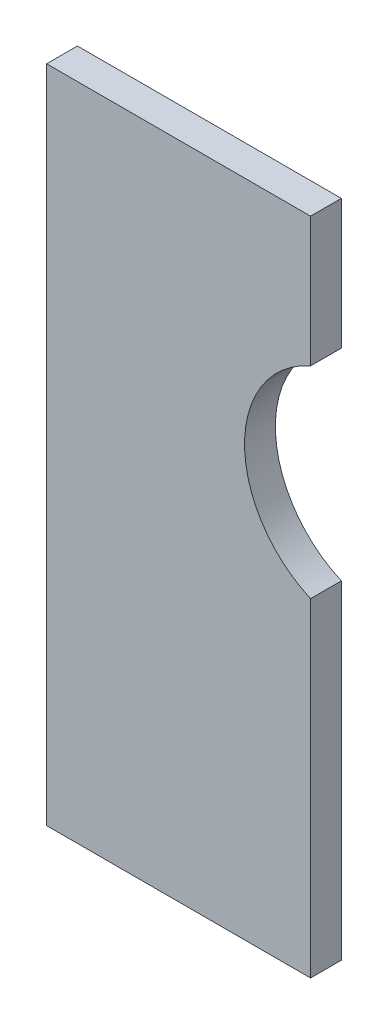
ISO-10303-21;
HEADER;
FILE_DESCRIPTION(('STEP AP214'),'2;1');
FILE_NAME('part.step','',(''),(''),'','','');
FILE_SCHEMA(('AUTOMOTIVE_DESIGN { 1 0 10303 214 1 1 1 1 }'));
ENDSEC;
DATA;
#1=APPLICATION_CONTEXT('core data for automotive mechanical design processes');
#2=APPLICATION_PROTOCOL_DEFINITION('international standard','automotive_design',2000,#1);
#3=PRODUCT_CONTEXT('',#1,'mechanical');
#4=PRODUCT('Part','Part','',(#3));
#5=PRODUCT_RELATED_PRODUCT_CATEGORY('part','',(#4));
#6=PRODUCT_DEFINITION_FORMATION('','',#4);
#7=PRODUCT_DEFINITION_CONTEXT('part definition',#1,'design');
#8=PRODUCT_DEFINITION('design','',#6,#7);
#9=PRODUCT_DEFINITION_SHAPE('','',#8);
#10=(LENGTH_UNIT() NAMED_UNIT(*) SI_UNIT(.MILLI.,.METRE.));
#11=(NAMED_UNIT(*) PLANE_ANGLE_UNIT() SI_UNIT($,.RADIAN.));
#12=(NAMED_UNIT(*) SI_UNIT($,.STERADIAN.) SOLID_ANGLE_UNIT());
#13=UNCERTAINTY_MEASURE_WITH_UNIT(LENGTH_MEASURE(1.E-05),#10,'distance_accuracy_value','');
#14=(GEOMETRIC_REPRESENTATION_CONTEXT(3) GLOBAL_UNCERTAINTY_ASSIGNED_CONTEXT((#13)) GLOBAL_UNIT_ASSIGNED_CONTEXT((#10,
#11,#12)) REPRESENTATION_CONTEXT('',''));
#15=CARTESIAN_POINT('',(0.,0.,0.));
#16=DIRECTION('',(0.,0.,1.));
#17=DIRECTION('',(1.,0.,0.));
#18=AXIS2_PLACEMENT_3D('',#15,#16,#17);
#19=CARTESIAN_POINT('',(150.45,-117.138,1.6));
#20=DIRECTION('',(1.,0.,0.));
#21=DIRECTION('',(0.,1.,0.));
#22=AXIS2_PLACEMENT_3D('',#19,#20,#21);
#23=PLANE('',#22);
#24=DIRECTION('',(0.,-1.,0.));
#25=VECTOR('',#24,1.);
#26=CARTESIAN_POINT('',(150.45,-117.138,1.6));
#27=LINE('',#26,#25);
#28=CARTESIAN_POINT('',(150.45,-117.138,1.6));
#29=VERTEX_POINT('',#28);
#30=CARTESIAN_POINT('',(150.45,-117.2854356076,1.6));
#31=VERTEX_POINT('',#30);
#32=EDGE_CURVE('E135',#29,#31,#27,.T.);
#33=ORIENTED_EDGE('',*,*,#32,.F.);
#34=DIRECTION('',(0.,0.,1.));
#35=VECTOR('',#34,1.);
#36=CARTESIAN_POINT('',(150.45,-117.138,1.6));
#37=LINE('',#36,#35);
#38=CARTESIAN_POINT('',(150.45,-117.138,1.635));
#39=VERTEX_POINT('',#38);
#40=EDGE_CURVE('E11',#29,#39,#37,.T.);
#41=ORIENTED_EDGE('',*,*,#40,.T.);
#42=DIRECTION('',(0.,-1.,0.));
#43=VECTOR('',#42,1.);
#44=CARTESIAN_POINT('',(150.45,-117.138,1.635));
#45=LINE('',#44,#43);
#46=CARTESIAN_POINT('',(150.45,-117.2854356076,1.635));
#47=VERTEX_POINT('',#46);
#48=EDGE_CURVE('E144',#39,#47,#45,.T.);
#49=ORIENTED_EDGE('',*,*,#48,.T.);
#50=DIRECTION('',(0.,0.,-1.));
#51=VECTOR('',#50,1.);
#52=CARTESIAN_POINT('',(150.45,-117.2854356076,-0.045));
#53=LINE('',#52,#51);
#54=EDGE_CURVE('E26',#47,#31,#53,.T.);
#55=ORIENTED_EDGE('',*,*,#54,.T.);
#56=EDGE_LOOP('',(#33,#41,#49,#55));
#57=FACE_BOUND('',#56,.T.);
#58=ADVANCED_FACE('F17',(#57),#23,.T.);
#59=CARTESIAN_POINT('',(150.15,-117.138,1.6));
#60=DIRECTION('',(0.,1.,0.));
#61=DIRECTION('',(1.,0.,0.));
#62=AXIS2_PLACEMENT_3D('',#59,#60,#61);
#63=PLANE('',#62);
#64=DIRECTION('',(0.,0.,1.));
#65=VECTOR('',#64,1.);
#66=CARTESIAN_POINT('',(150.15,-117.138,1.6));
#67=LINE('',#66,#65);
#68=CARTESIAN_POINT('',(150.15,-117.138,1.6));
#69=VERTEX_POINT('',#68);
#70=CARTESIAN_POINT('',(150.15,-117.138,1.635));
#71=VERTEX_POINT('',#70);
#72=EDGE_CURVE('E140',#69,#71,#67,.T.);
#73=ORIENTED_EDGE('',*,*,#72,.T.);
#74=DIRECTION('',(1.,0.,0.));
#75=VECTOR('',#74,1.);
#76=CARTESIAN_POINT('',(150.15,-117.138,1.635));
#77=LINE('',#76,#75);
#78=EDGE_CURVE('E67',#71,#39,#77,.T.);
#79=ORIENTED_EDGE('',*,*,#78,.T.);
#80=ORIENTED_EDGE('',*,*,#40,.F.);
#81=DIRECTION('',(1.,0.,0.));
#82=VECTOR('',#81,1.);
#83=CARTESIAN_POINT('',(150.15,-117.138,1.6));
#84=LINE('',#83,#82);
#85=EDGE_CURVE('E56',#69,#29,#84,.T.);
#86=ORIENTED_EDGE('',*,*,#85,.F.);
#87=EDGE_LOOP('',(#73,#79,#80,#86));
#88=FACE_BOUND('',#87,.T.);
#89=ADVANCED_FACE('F165',(#88),#63,.T.);
#90=CARTESIAN_POINT('',(150.5,-117.4,-0.045));
#91=DIRECTION('',(0.,0.,-1.));
#92=DIRECTION('',(0.,-1.,0.));
#93=AXIS2_PLACEMENT_3D('',#90,#91,#92);
#94=CYLINDRICAL_SURFACE('',#93,0.125);
#95=ORIENTED_EDGE('',*,*,#54,.F.);
#96=CARTESIAN_POINT('',(150.5,-117.4,1.635));
#97=DIRECTION('',(0.,0.,-1.));
#98=DIRECTION('',(0.,-1.,0.));
#99=AXIS2_PLACEMENT_3D('',#96,#97,#98);
#100=CIRCLE('',#99,0.125);
#101=CARTESIAN_POINT('',(150.45,-117.5145643923,1.635));
#102=VERTEX_POINT('',#101);
#103=EDGE_CURVE('E147',#102,#47,#100,.T.);
#104=ORIENTED_EDGE('',*,*,#103,.F.);
#105=DIRECTION('',(0.,0.,-1.));
#106=VECTOR('',#105,1.);
#107=CARTESIAN_POINT('',(150.45,-117.5145643923,-0.045));
#108=LINE('',#107,#106);
#109=CARTESIAN_POINT('',(150.45,-117.5145643923,1.6));
#110=VERTEX_POINT('',#109);
#111=EDGE_CURVE('E111',#102,#110,#108,.T.);
#112=ORIENTED_EDGE('',*,*,#111,.T.);
#113=CARTESIAN_POINT('',(150.5,-117.4,1.6));
#114=DIRECTION('',(0.,0.,-1.));
#115=DIRECTION('',(0.,-1.,0.));
#116=AXIS2_PLACEMENT_3D('',#113,#114,#115);
#117=CIRCLE('',#116,0.125);
#118=EDGE_CURVE('E79',#110,#31,#117,.T.);
#119=ORIENTED_EDGE('',*,*,#118,.T.);
#120=EDGE_LOOP('',(#95,#104,#112,#119));
#121=FACE_BOUND('',#120,.T.);
#122=ADVANCED_FACE('F169',(#121),#94,.F.);
#123=CARTESIAN_POINT('',(150.3,-117.513,1.635));
#124=DIRECTION('',(0.,0.,-1.));
#125=DIRECTION('',(0.,-1.,0.));
#126=AXIS2_PLACEMENT_3D('',#123,#124,#125);
#127=PLANE('',#126);
#128=ORIENTED_EDGE('',*,*,#103,.T.);
#129=ORIENTED_EDGE('',*,*,#48,.F.);
#130=ORIENTED_EDGE('',*,*,#78,.F.);
#131=DIRECTION('',(0.,1.,0.));
#132=VECTOR('',#131,1.);
#133=CARTESIAN_POINT('',(150.15,-117.888,1.635));
#134=LINE('',#133,#132);
#135=CARTESIAN_POINT('',(150.15,-117.888,1.635));
#136=VERTEX_POINT('',#135);
#137=EDGE_CURVE('E137',#136,#71,#134,.T.);
#138=ORIENTED_EDGE('',*,*,#137,.F.);
#139=DIRECTION('',(-1.,0.,0.));
#140=VECTOR('',#139,1.);
#141=CARTESIAN_POINT('',(150.45,-117.888,1.635));
#142=LINE('',#141,#140);
#143=CARTESIAN_POINT('',(150.45,-117.888,1.635));
#144=VERTEX_POINT('',#143);
#145=EDGE_CURVE('E126',#144,#136,#142,.T.);
#146=ORIENTED_EDGE('',*,*,#145,.F.);
#147=DIRECTION('',(0.,-1.,0.));
#148=VECTOR('',#147,1.);
#149=CARTESIAN_POINT('',(150.45,-117.138,1.635));
#150=LINE('',#149,#148);
#151=EDGE_CURVE('E123',#102,#144,#150,.T.);
#152=ORIENTED_EDGE('',*,*,#151,.F.);
#153=EDGE_LOOP('',(#128,#129,#130,#138,#146,#152));
#154=FACE_BOUND('',#153,.T.);
#155=ADVANCED_FACE('F167',(#154),#127,.F.);
#156=CARTESIAN_POINT('',(150.3,-117.513,1.6));
#157=DIRECTION('',(0.,0.,-1.));
#158=DIRECTION('',(0.,-1.,0.));
#159=AXIS2_PLACEMENT_3D('',#156,#157,#158);
#160=PLANE('',#159);
#161=DIRECTION('',(0.,-1.,0.));
#162=VECTOR('',#161,1.);
#163=CARTESIAN_POINT('',(150.45,-117.138,1.6));
#164=LINE('',#163,#162);
#165=CARTESIAN_POINT('',(150.45,-117.888,1.6));
#166=VERTEX_POINT('',#165);
#167=EDGE_CURVE('E102',#110,#166,#164,.T.);
#168=ORIENTED_EDGE('',*,*,#167,.T.);
#169=DIRECTION('',(-1.,0.,0.));
#170=VECTOR('',#169,1.);
#171=CARTESIAN_POINT('',(150.45,-117.888,1.6));
#172=LINE('',#171,#170);
#173=CARTESIAN_POINT('',(150.15,-117.888,1.6));
#174=VERTEX_POINT('',#173);
#175=EDGE_CURVE('E105',#166,#174,#172,.T.);
#176=ORIENTED_EDGE('',*,*,#175,.T.);
#177=DIRECTION('',(0.,1.,0.));
#178=VECTOR('',#177,1.);
#179=CARTESIAN_POINT('',(150.15,-117.888,1.6));
#180=LINE('',#179,#178);
#181=EDGE_CURVE('E89',#174,#69,#180,.T.);
#182=ORIENTED_EDGE('',*,*,#181,.T.);
#183=ORIENTED_EDGE('',*,*,#85,.T.);
#184=ORIENTED_EDGE('',*,*,#32,.T.);
#185=ORIENTED_EDGE('',*,*,#118,.F.);
#186=EDGE_LOOP('',(#168,#176,#182,#183,#184,#185));
#187=FACE_BOUND('',#186,.T.);
#188=ADVANCED_FACE('F104',(#187),#160,.T.);
#189=CARTESIAN_POINT('',(150.15,-117.888,1.6));
#190=DIRECTION('',(-1.,0.,0.));
#191=DIRECTION('',(0.,0.,1.));
#192=AXIS2_PLACEMENT_3D('',#189,#190,#191);
#193=PLANE('',#192);
#194=DIRECTION('',(0.,0.,1.));
#195=VECTOR('',#194,1.);
#196=CARTESIAN_POINT('',(150.15,-117.888,1.6));
#197=LINE('',#196,#195);
#198=EDGE_CURVE('E118',#174,#136,#197,.T.);
#199=ORIENTED_EDGE('',*,*,#198,.T.);
#200=ORIENTED_EDGE('',*,*,#137,.T.);
#201=ORIENTED_EDGE('',*,*,#72,.F.);
#202=ORIENTED_EDGE('',*,*,#181,.F.);
#203=EDGE_LOOP('',(#199,#200,#201,#202));
#204=FACE_BOUND('',#203,.T.);
#205=ADVANCED_FACE('F164',(#204),#193,.T.);
#206=CARTESIAN_POINT('',(150.45,-117.138,1.6));
#207=DIRECTION('',(1.,0.,0.));
#208=DIRECTION('',(0.,1.,0.));
#209=AXIS2_PLACEMENT_3D('',#206,#207,#208);
#210=PLANE('',#209);
#211=ORIENTED_EDGE('',*,*,#167,.F.);
#212=ORIENTED_EDGE('',*,*,#111,.F.);
#213=ORIENTED_EDGE('',*,*,#151,.T.);
#214=DIRECTION('',(0.,0.,1.));
#215=VECTOR('',#214,1.);
#216=CARTESIAN_POINT('',(150.45,-117.888,1.6));
#217=LINE('',#216,#215);
#218=EDGE_CURVE('E117',#166,#144,#217,.T.);
#219=ORIENTED_EDGE('',*,*,#218,.F.);
#220=EDGE_LOOP('',(#211,#212,#213,#219));
#221=FACE_BOUND('',#220,.T.);
#222=ADVANCED_FACE('F121',(#221),#210,.T.);
#223=CARTESIAN_POINT('',(150.45,-117.888,1.6));
#224=DIRECTION('',(0.,-1.,0.));
#225=DIRECTION('',(0.,0.,-1.));
#226=AXIS2_PLACEMENT_3D('',#223,#224,#225);
#227=PLANE('',#226);
#228=ORIENTED_EDGE('',*,*,#218,.T.);
#229=ORIENTED_EDGE('',*,*,#145,.T.);
#230=ORIENTED_EDGE('',*,*,#198,.F.);
#231=ORIENTED_EDGE('',*,*,#175,.F.);
#232=EDGE_LOOP('',(#228,#229,#230,#231));
#233=FACE_BOUND('',#232,.T.);
#234=ADVANCED_FACE('F115',(#233),#227,.T.);
#235=CLOSED_SHELL('',(#58,#89,#122,#155,#188,#205,#222,#234));
#236=MANIFOLD_SOLID_BREP('B1',#235);
#237=ADVANCED_BREP_SHAPE_REPRESENTATION('',(#18,#236),#14);
#238=SHAPE_DEFINITION_REPRESENTATION(#9,#237);
ENDSEC;
END-ISO-10303-21;
